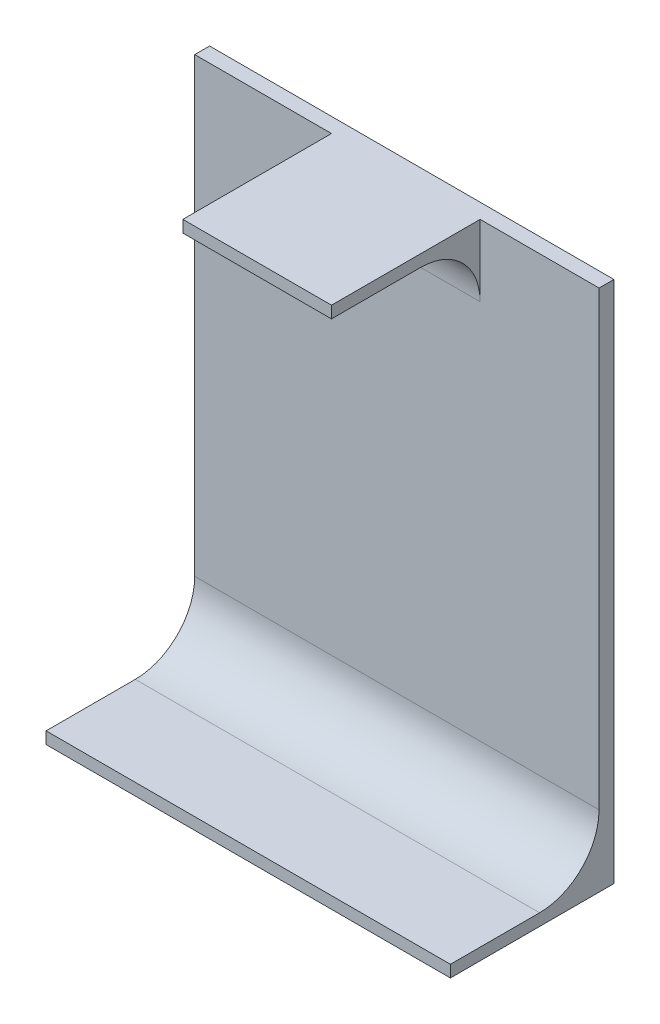
ISO-10303-21;
HEADER;
FILE_DESCRIPTION(('STEP AP214'),'2;1');
FILE_NAME('part.step','',(''),(''),'','','');
FILE_SCHEMA(('AUTOMOTIVE_DESIGN { 1 0 10303 214 1 1 1 1 }'));
ENDSEC;
DATA;
#1=APPLICATION_CONTEXT('core data for automotive mechanical design processes');
#2=APPLICATION_PROTOCOL_DEFINITION('international standard','automotive_design',2000,#1);
#3=PRODUCT_CONTEXT('',#1,'mechanical');
#4=PRODUCT('Part','Part','',(#3));
#5=PRODUCT_RELATED_PRODUCT_CATEGORY('part','',(#4));
#6=PRODUCT_DEFINITION_FORMATION('','',#4);
#7=PRODUCT_DEFINITION_CONTEXT('part definition',#1,'design');
#8=PRODUCT_DEFINITION('design','',#6,#7);
#9=PRODUCT_DEFINITION_SHAPE('','',#8);
#10=(LENGTH_UNIT() NAMED_UNIT(*) SI_UNIT(.MILLI.,.METRE.));
#11=(NAMED_UNIT(*) PLANE_ANGLE_UNIT() SI_UNIT($,.RADIAN.));
#12=(NAMED_UNIT(*) SI_UNIT($,.STERADIAN.) SOLID_ANGLE_UNIT());
#13=UNCERTAINTY_MEASURE_WITH_UNIT(LENGTH_MEASURE(1.E-05),#10,'distance_accuracy_value','');
#14=(GEOMETRIC_REPRESENTATION_CONTEXT(3) GLOBAL_UNCERTAINTY_ASSIGNED_CONTEXT((#13)) GLOBAL_UNIT_ASSIGNED_CONTEXT((#10,
#11,#12)) REPRESENTATION_CONTEXT('',''));
#15=CARTESIAN_POINT('',(0.,0.,0.));
#16=DIRECTION('',(0.,0.,1.));
#17=DIRECTION('',(1.,0.,0.));
#18=AXIS2_PLACEMENT_3D('',#15,#16,#17);
#19=CARTESIAN_POINT('',(-68.,0.,-2.5));
#20=DIRECTION('',(-1.,0.,0.));
#21=DIRECTION('',(0.,-1.,0.));
#22=AXIS2_PLACEMENT_3D('',#19,#20,#21);
#23=PLANE('',#22);
#24=DIRECTION('',(0.,0.,1.));
#25=VECTOR('',#24,1.);
#26=CARTESIAN_POINT('',(-68.,-86.,-2.5));
#27=LINE('',#26,#25);
#28=CARTESIAN_POINT('',(-68.,-86.,10.));
#29=VERTEX_POINT('',#28);
#30=CARTESIAN_POINT('',(-68.,-86.,25.));
#31=VERTEX_POINT('',#30);
#32=EDGE_CURVE('E182',#29,#31,#27,.T.);
#33=ORIENTED_EDGE('',*,*,#32,.F.);
#34=CARTESIAN_POINT('',(-68.,-76.,10.));
#35=DIRECTION('',(-1.,0.,0.));
#36=DIRECTION('',(0.,-1.,0.));
#37=AXIS2_PLACEMENT_3D('',#34,#35,#36);
#38=CIRCLE('',#37,10.);
#39=CARTESIAN_POINT('',(-68.,-76.,0.));
#40=VERTEX_POINT('',#39);
#41=EDGE_CURVE('E176',#29,#40,#38,.F.);
#42=ORIENTED_EDGE('',*,*,#41,.T.);
#43=DIRECTION('',(0.,1.,0.));
#44=VECTOR('',#43,1.);
#45=CARTESIAN_POINT('',(-68.,0.,0.));
#46=LINE('',#45,#44);
#47=CARTESIAN_POINT('',(-68.,0.,0.));
#48=VERTEX_POINT('',#47);
#49=EDGE_CURVE('E165',#40,#48,#46,.T.);
#50=ORIENTED_EDGE('',*,*,#49,.T.);
#51=DIRECTION('',(0.,0.,1.));
#52=VECTOR('',#51,1.);
#53=CARTESIAN_POINT('',(-68.,0.,-2.5));
#54=LINE('',#53,#52);
#55=CARTESIAN_POINT('',(-68.,0.,-2.5));
#56=VERTEX_POINT('',#55);
#57=EDGE_CURVE('E147',#56,#48,#54,.T.);
#58=ORIENTED_EDGE('',*,*,#57,.F.);
#59=DIRECTION('',(0.,-1.,0.));
#60=VECTOR('',#59,1.);
#61=CARTESIAN_POINT('',(-68.,0.,-2.5));
#62=LINE('',#61,#60);
#63=CARTESIAN_POINT('',(-68.,-88.,-2.5));
#64=VERTEX_POINT('',#63);
#65=EDGE_CURVE('E154',#56,#64,#62,.T.);
#66=ORIENTED_EDGE('',*,*,#65,.T.);
#67=DIRECTION('',(0.,0.,1.));
#68=VECTOR('',#67,1.);
#69=CARTESIAN_POINT('',(-68.,-88.,-2.5));
#70=LINE('',#69,#68);
#71=CARTESIAN_POINT('',(-68.,-88.,25.));
#72=VERTEX_POINT('',#71);
#73=EDGE_CURVE('E151',#64,#72,#70,.T.);
#74=ORIENTED_EDGE('',*,*,#73,.T.);
#75=DIRECTION('',(0.,-1.,0.));
#76=VECTOR('',#75,1.);
#77=CARTESIAN_POINT('',(-68.,0.,25.));
#78=LINE('',#77,#76);
#79=EDGE_CURVE('E202',#31,#72,#78,.T.);
#80=ORIENTED_EDGE('',*,*,#79,.F.);
#81=EDGE_LOOP('',(#33,#42,#50,#58,#66,#74,#80));
#82=FACE_BOUND('',#81,.T.);
#83=ADVANCED_FACE('F33',(#82),#23,.T.);
#84=CARTESIAN_POINT('',(0.,0.,-2.5));
#85=DIRECTION('',(0.,1.,0.));
#86=DIRECTION('',(-1.,0.,0.));
#87=AXIS2_PLACEMENT_3D('',#84,#85,#86);
#88=PLANE('',#87);
#89=DIRECTION('',(0.,0.,1.));
#90=VECTOR('',#89,1.);
#91=CARTESIAN_POINT('',(-20.,0.,25.));
#92=LINE('',#91,#90);
#93=CARTESIAN_POINT('',(-20.,0.,0.));
#94=VERTEX_POINT('',#93);
#95=CARTESIAN_POINT('',(-20.,0.,25.));
#96=VERTEX_POINT('',#95);
#97=EDGE_CURVE('E141',#94,#96,#92,.T.);
#98=ORIENTED_EDGE('',*,*,#97,.F.);
#99=DIRECTION('',(-1.,0.,0.));
#100=VECTOR('',#99,1.);
#101=CARTESIAN_POINT('',(0.,0.,0.));
#102=LINE('',#101,#100);
#103=CARTESIAN_POINT('',(0.,0.,0.));
#104=VERTEX_POINT('',#103);
#105=EDGE_CURVE('E126',#104,#94,#102,.T.);
#106=ORIENTED_EDGE('',*,*,#105,.F.);
#107=DIRECTION('',(0.,0.,1.));
#108=VECTOR('',#107,1.);
#109=CARTESIAN_POINT('',(0.,0.,-2.5));
#110=LINE('',#109,#108);
#111=CARTESIAN_POINT('',(0.,0.,-2.5));
#112=VERTEX_POINT('',#111);
#113=EDGE_CURVE('E138',#112,#104,#110,.T.);
#114=ORIENTED_EDGE('',*,*,#113,.F.);
#115=DIRECTION('',(-1.,0.,0.));
#116=VECTOR('',#115,1.);
#117=CARTESIAN_POINT('',(0.,0.,-2.5));
#118=LINE('',#117,#116);
#119=EDGE_CURVE('E208',#112,#56,#118,.T.);
#120=ORIENTED_EDGE('',*,*,#119,.T.);
#121=ORIENTED_EDGE('',*,*,#57,.T.);
#122=DIRECTION('',(1.,0.,0.));
#123=VECTOR('',#122,1.);
#124=CARTESIAN_POINT('',(-68.,0.,0.));
#125=LINE('',#124,#123);
#126=CARTESIAN_POINT('',(-45.,0.,0.));
#127=VERTEX_POINT('',#126);
#128=EDGE_CURVE('E186',#48,#127,#125,.T.);
#129=ORIENTED_EDGE('',*,*,#128,.T.);
#130=DIRECTION('',(0.,0.,-1.));
#131=VECTOR('',#130,1.);
#132=CARTESIAN_POINT('',(-45.,0.,25.));
#133=LINE('',#132,#131);
#134=CARTESIAN_POINT('',(-45.,0.,25.));
#135=VERTEX_POINT('',#134);
#136=EDGE_CURVE('E224',#135,#127,#133,.T.);
#137=ORIENTED_EDGE('',*,*,#136,.F.);
#138=DIRECTION('',(-1.,0.,0.));
#139=VECTOR('',#138,1.);
#140=CARTESIAN_POINT('',(0.,0.,25.));
#141=LINE('',#140,#139);
#142=EDGE_CURVE('E200',#96,#135,#141,.T.);
#143=ORIENTED_EDGE('',*,*,#142,.F.);
#144=EDGE_LOOP('',(#98,#106,#114,#120,#121,#129,#137,#143));
#145=FACE_BOUND('',#144,.T.);
#146=ADVANCED_FACE('F136',(#145),#88,.T.);
#147=CARTESIAN_POINT('',(0.,0.,25.));
#148=DIRECTION('',(0.,0.,-1.));
#149=DIRECTION('',(-1.,0.,0.));
#150=AXIS2_PLACEMENT_3D('',#147,#148,#149);
#151=PLANE('',#150);
#152=DIRECTION('',(1.,0.,0.));
#153=VECTOR('',#152,1.);
#154=CARTESIAN_POINT('',(0.,-2.,25.));
#155=LINE('',#154,#153);
#156=CARTESIAN_POINT('',(-45.,-2.,25.));
#157=VERTEX_POINT('',#156);
#158=CARTESIAN_POINT('',(-20.,-2.,25.));
#159=VERTEX_POINT('',#158);
#160=EDGE_CURVE('E161',#157,#159,#155,.T.);
#161=ORIENTED_EDGE('',*,*,#160,.T.);
#162=DIRECTION('',(0.,1.,0.));
#163=VECTOR('',#162,1.);
#164=CARTESIAN_POINT('',(-20.,-25.,25.));
#165=LINE('',#164,#163);
#166=EDGE_CURVE('E229',#159,#96,#165,.T.);
#167=ORIENTED_EDGE('',*,*,#166,.T.);
#168=ORIENTED_EDGE('',*,*,#142,.T.);
#169=DIRECTION('',(0.,1.,0.));
#170=VECTOR('',#169,1.);
#171=CARTESIAN_POINT('',(-45.,-25.,25.));
#172=LINE('',#171,#170);
#173=EDGE_CURVE('E227',#157,#135,#172,.T.);
#174=ORIENTED_EDGE('',*,*,#173,.F.);
#175=EDGE_LOOP('',(#161,#167,#168,#174));
#176=FACE_BOUND('',#175,.T.);
#177=ADVANCED_FACE('F249',(#176),#151,.F.);
#178=CARTESIAN_POINT('',(0.,0.,-2.5));
#179=DIRECTION('',(1.,0.,0.));
#180=DIRECTION('',(0.,1.,0.));
#181=AXIS2_PLACEMENT_3D('',#178,#179,#180);
#182=PLANE('',#181);
#183=ORIENTED_EDGE('',*,*,#113,.T.);
#184=DIRECTION('',(0.,-1.,0.));
#185=VECTOR('',#184,1.);
#186=CARTESIAN_POINT('',(0.,0.,0.));
#187=LINE('',#186,#185);
#188=CARTESIAN_POINT('',(0.,-76.,0.));
#189=VERTEX_POINT('',#188);
#190=EDGE_CURVE('E122',#104,#189,#187,.T.);
#191=ORIENTED_EDGE('',*,*,#190,.T.);
#192=CARTESIAN_POINT('',(0.,-76.,10.));
#193=DIRECTION('',(1.,0.,0.));
#194=DIRECTION('',(0.,1.,0.));
#195=AXIS2_PLACEMENT_3D('',#192,#193,#194);
#196=CIRCLE('',#195,10.);
#197=CARTESIAN_POINT('',(0.,-86.,10.));
#198=VERTEX_POINT('',#197);
#199=EDGE_CURVE('E174',#189,#198,#196,.F.);
#200=ORIENTED_EDGE('',*,*,#199,.T.);
#201=DIRECTION('',(0.,0.,-1.));
#202=VECTOR('',#201,1.);
#203=CARTESIAN_POINT('',(0.,-86.,-2.5));
#204=LINE('',#203,#202);
#205=CARTESIAN_POINT('',(0.,-86.,25.));
#206=VERTEX_POINT('',#205);
#207=EDGE_CURVE('E133',#206,#198,#204,.T.);
#208=ORIENTED_EDGE('',*,*,#207,.F.);
#209=DIRECTION('',(0.,1.,0.));
#210=VECTOR('',#209,1.);
#211=CARTESIAN_POINT('',(0.,0.,25.));
#212=LINE('',#211,#210);
#213=CARTESIAN_POINT('',(0.,-88.,25.));
#214=VERTEX_POINT('',#213);
#215=EDGE_CURVE('E132',#214,#206,#212,.T.);
#216=ORIENTED_EDGE('',*,*,#215,.F.);
#217=DIRECTION('',(0.,0.,1.));
#218=VECTOR('',#217,1.);
#219=CARTESIAN_POINT('',(0.,-88.,-2.5));
#220=LINE('',#219,#218);
#221=CARTESIAN_POINT('',(0.,-88.,-2.5));
#222=VERTEX_POINT('',#221);
#223=EDGE_CURVE('E162',#222,#214,#220,.T.);
#224=ORIENTED_EDGE('',*,*,#223,.F.);
#225=DIRECTION('',(0.,1.,0.));
#226=VECTOR('',#225,1.);
#227=CARTESIAN_POINT('',(0.,0.,-2.5));
#228=LINE('',#227,#226);
#229=EDGE_CURVE('E146',#222,#112,#228,.T.);
#230=ORIENTED_EDGE('',*,*,#229,.T.);
#231=EDGE_LOOP('',(#183,#191,#200,#208,#216,#224,#230));
#232=FACE_BOUND('',#231,.T.);
#233=ADVANCED_FACE('F144',(#232),#182,.T.);
#234=CARTESIAN_POINT('',(0.,-88.,-2.5));
#235=DIRECTION('',(0.,-1.,0.));
#236=DIRECTION('',(1.,0.,0.));
#237=AXIS2_PLACEMENT_3D('',#234,#235,#236);
#238=PLANE('',#237);
#239=ORIENTED_EDGE('',*,*,#223,.T.);
#240=DIRECTION('',(1.,0.,0.));
#241=VECTOR('',#240,1.);
#242=CARTESIAN_POINT('',(0.,-88.,25.));
#243=LINE('',#242,#241);
#244=EDGE_CURVE('E204',#72,#214,#243,.T.);
#245=ORIENTED_EDGE('',*,*,#244,.F.);
#246=ORIENTED_EDGE('',*,*,#73,.F.);
#247=DIRECTION('',(1.,0.,0.));
#248=VECTOR('',#247,1.);
#249=CARTESIAN_POINT('',(0.,-88.,-2.5));
#250=LINE('',#249,#248);
#251=EDGE_CURVE('E148',#64,#222,#250,.T.);
#252=ORIENTED_EDGE('',*,*,#251,.T.);
#253=EDGE_LOOP('',(#239,#245,#246,#252));
#254=FACE_BOUND('',#253,.T.);
#255=ADVANCED_FACE('F217',(#254),#238,.T.);
#256=CARTESIAN_POINT('',(0.,0.,-2.5));
#257=DIRECTION('',(0.,0.,-1.));
#258=DIRECTION('',(-1.,0.,0.));
#259=AXIS2_PLACEMENT_3D('',#256,#257,#258);
#260=PLANE('',#259);
#261=ORIENTED_EDGE('',*,*,#229,.F.);
#262=ORIENTED_EDGE('',*,*,#251,.F.);
#263=ORIENTED_EDGE('',*,*,#65,.F.);
#264=ORIENTED_EDGE('',*,*,#119,.F.);
#265=EDGE_LOOP('',(#261,#262,#263,#264));
#266=FACE_BOUND('',#265,.T.);
#267=ADVANCED_FACE('F221',(#266),#260,.T.);
#268=ORIENTED_EDGE('',*,*,#215,.T.);
#269=DIRECTION('',(-1.,0.,0.));
#270=VECTOR('',#269,1.);
#271=CARTESIAN_POINT('',(0.,-86.,25.));
#272=LINE('',#271,#270);
#273=EDGE_CURVE('E158',#206,#31,#272,.T.);
#274=ORIENTED_EDGE('',*,*,#273,.T.);
#275=ORIENTED_EDGE('',*,*,#79,.T.);
#276=ORIENTED_EDGE('',*,*,#244,.T.);
#277=EDGE_LOOP('',(#268,#274,#275,#276));
#278=FACE_BOUND('',#277,.T.);
#279=ADVANCED_FACE('F219',(#278),#151,.F.);
#280=CARTESIAN_POINT('',(-75.1787098022731,-2.,0.));
#281=DIRECTION('',(0.,1.,0.));
#282=DIRECTION('',(0.,0.,1.));
#283=AXIS2_PLACEMENT_3D('',#280,#281,#282);
#284=PLANE('',#283);
#285=DIRECTION('',(0.,0.,-1.));
#286=VECTOR('',#285,1.);
#287=CARTESIAN_POINT('',(-45.,-2.,0.));
#288=LINE('',#287,#286);
#289=CARTESIAN_POINT('',(-45.,-2.,10.));
#290=VERTEX_POINT('',#289);
#291=EDGE_CURVE('E195',#157,#290,#288,.T.);
#292=ORIENTED_EDGE('',*,*,#291,.T.);
#293=DIRECTION('',(-1.,0.,0.));
#294=VECTOR('',#293,1.);
#295=CARTESIAN_POINT('',(-75.1787098022731,-2.,10.));
#296=LINE('',#295,#294);
#297=CARTESIAN_POINT('',(-20.,-2.,10.));
#298=VERTEX_POINT('',#297);
#299=EDGE_CURVE('E54',#290,#298,#296,.F.);
#300=ORIENTED_EDGE('',*,*,#299,.T.);
#301=DIRECTION('',(0.,0.,1.));
#302=VECTOR('',#301,1.);
#303=CARTESIAN_POINT('',(-20.,-2.,0.));
#304=LINE('',#303,#302);
#305=EDGE_CURVE('E225',#298,#159,#304,.T.);
#306=ORIENTED_EDGE('',*,*,#305,.T.);
#307=ORIENTED_EDGE('',*,*,#160,.F.);
#308=EDGE_LOOP('',(#292,#300,#306,#307));
#309=FACE_BOUND('',#308,.T.);
#310=ADVANCED_FACE('F237',(#309),#284,.F.);
#311=CARTESIAN_POINT('',(-75.1787098022731,-86.,0.));
#312=DIRECTION('',(0.,-1.,0.));
#313=DIRECTION('',(0.,0.,-1.));
#314=AXIS2_PLACEMENT_3D('',#311,#312,#313);
#315=PLANE('',#314);
#316=ORIENTED_EDGE('',*,*,#207,.T.);
#317=DIRECTION('',(1.,0.,0.));
#318=VECTOR('',#317,1.);
#319=CARTESIAN_POINT('',(-75.1787098022731,-86.,10.));
#320=LINE('',#319,#318);
#321=EDGE_CURVE('E171',#198,#29,#320,.F.);
#322=ORIENTED_EDGE('',*,*,#321,.T.);
#323=ORIENTED_EDGE('',*,*,#32,.T.);
#324=ORIENTED_EDGE('',*,*,#273,.F.);
#325=EDGE_LOOP('',(#316,#322,#323,#324));
#326=FACE_BOUND('',#325,.T.);
#327=ADVANCED_FACE('F193',(#326),#315,.F.);
#328=CARTESIAN_POINT('',(0.,0.,0.));
#329=DIRECTION('',(0.,0.,1.));
#330=DIRECTION('',(1.,0.,0.));
#331=AXIS2_PLACEMENT_3D('',#328,#329,#330);
#332=PLANE('',#331);
#333=ORIENTED_EDGE('',*,*,#49,.F.);
#334=DIRECTION('',(1.,0.,0.));
#335=VECTOR('',#334,1.);
#336=CARTESIAN_POINT('',(0.,-76.,0.));
#337=LINE('',#336,#335);
#338=EDGE_CURVE('E129',#40,#189,#337,.T.);
#339=ORIENTED_EDGE('',*,*,#338,.T.);
#340=ORIENTED_EDGE('',*,*,#190,.F.);
#341=ORIENTED_EDGE('',*,*,#105,.T.);
#342=DIRECTION('',(0.,1.,0.));
#343=VECTOR('',#342,1.);
#344=CARTESIAN_POINT('',(-20.,-25.,0.));
#345=LINE('',#344,#343);
#346=CARTESIAN_POINT('',(-20.,-12.,0.));
#347=VERTEX_POINT('',#346);
#348=EDGE_CURVE('E244',#347,#94,#345,.T.);
#349=ORIENTED_EDGE('',*,*,#348,.F.);
#350=DIRECTION('',(-1.,0.,0.));
#351=VECTOR('',#350,1.);
#352=CARTESIAN_POINT('',(0.,-12.,0.));
#353=LINE('',#352,#351);
#354=CARTESIAN_POINT('',(-45.,-12.,0.));
#355=VERTEX_POINT('',#354);
#356=EDGE_CURVE('E167',#347,#355,#353,.T.);
#357=ORIENTED_EDGE('',*,*,#356,.T.);
#358=DIRECTION('',(0.,1.,0.));
#359=VECTOR('',#358,1.);
#360=CARTESIAN_POINT('',(-45.,-25.,0.));
#361=LINE('',#360,#359);
#362=EDGE_CURVE('E235',#355,#127,#361,.T.);
#363=ORIENTED_EDGE('',*,*,#362,.T.);
#364=ORIENTED_EDGE('',*,*,#128,.F.);
#365=EDGE_LOOP('',(#333,#339,#340,#341,#349,#357,#363,#364));
#366=FACE_BOUND('',#365,.T.);
#367=ADVANCED_FACE('F125',(#366),#332,.T.);
#368=CARTESIAN_POINT('',(-45.,-25.,25.));
#369=DIRECTION('',(1.,0.,0.));
#370=DIRECTION('',(0.,1.,0.));
#371=AXIS2_PLACEMENT_3D('',#368,#369,#370);
#372=PLANE('',#371);
#373=ORIENTED_EDGE('',*,*,#173,.T.);
#374=ORIENTED_EDGE('',*,*,#136,.T.);
#375=ORIENTED_EDGE('',*,*,#362,.F.);
#376=CARTESIAN_POINT('',(-45.,-12.,10.));
#377=DIRECTION('',(1.,0.,0.));
#378=DIRECTION('',(0.,1.,0.));
#379=AXIS2_PLACEMENT_3D('',#376,#377,#378);
#380=CIRCLE('',#379,10.);
#381=EDGE_CURVE('E41',#355,#290,#380,.T.);
#382=ORIENTED_EDGE('',*,*,#381,.T.);
#383=ORIENTED_EDGE('',*,*,#291,.F.);
#384=EDGE_LOOP('',(#373,#374,#375,#382,#383));
#385=FACE_BOUND('',#384,.T.);
#386=ADVANCED_FACE('F250',(#385),#372,.F.);
#387=CARTESIAN_POINT('',(-20.,-25.,25.));
#388=DIRECTION('',(-1.,0.,0.));
#389=DIRECTION('',(0.,-1.,0.));
#390=AXIS2_PLACEMENT_3D('',#387,#388,#389);
#391=PLANE('',#390);
#392=ORIENTED_EDGE('',*,*,#348,.T.);
#393=ORIENTED_EDGE('',*,*,#97,.T.);
#394=ORIENTED_EDGE('',*,*,#166,.F.);
#395=ORIENTED_EDGE('',*,*,#305,.F.);
#396=CARTESIAN_POINT('',(-20.,-12.,10.));
#397=DIRECTION('',(-1.,0.,0.));
#398=DIRECTION('',(0.,-1.,0.));
#399=AXIS2_PLACEMENT_3D('',#396,#397,#398);
#400=CIRCLE('',#399,10.);
#401=EDGE_CURVE('E11',#298,#347,#400,.T.);
#402=ORIENTED_EDGE('',*,*,#401,.T.);
#403=EDGE_LOOP('',(#392,#393,#394,#395,#402));
#404=FACE_BOUND('',#403,.T.);
#405=ADVANCED_FACE('F243',(#404),#391,.F.);
#406=CARTESIAN_POINT('',(0.,-76.,10.));
#407=DIRECTION('',(1.,0.,0.));
#408=DIRECTION('',(0.,0.,-1.));
#409=AXIS2_PLACEMENT_3D('',#406,#407,#408);
#410=CYLINDRICAL_SURFACE('',#409,10.);
#411=ORIENTED_EDGE('',*,*,#41,.F.);
#412=ORIENTED_EDGE('',*,*,#321,.F.);
#413=ORIENTED_EDGE('',*,*,#199,.F.);
#414=ORIENTED_EDGE('',*,*,#338,.F.);
#415=EDGE_LOOP('',(#411,#412,#413,#414));
#416=FACE_BOUND('',#415,.T.);
#417=ADVANCED_FACE('F187',(#416),#410,.F.);
#418=CARTESIAN_POINT('',(0.,-12.,10.));
#419=DIRECTION('',(-1.,0.,0.));
#420=DIRECTION('',(0.,0.,1.));
#421=AXIS2_PLACEMENT_3D('',#418,#419,#420);
#422=CYLINDRICAL_SURFACE('',#421,10.);
#423=ORIENTED_EDGE('',*,*,#401,.F.);
#424=ORIENTED_EDGE('',*,*,#299,.F.);
#425=ORIENTED_EDGE('',*,*,#381,.F.);
#426=ORIENTED_EDGE('',*,*,#356,.F.);
#427=EDGE_LOOP('',(#423,#424,#425,#426));
#428=FACE_BOUND('',#427,.T.);
#429=ADVANCED_FACE('F35',(#428),#422,.F.);
#430=CLOSED_SHELL('',(#83,#146,#177,#233,#255,#267,#279,#310,#327,#367,#386,#405,#417,#429));
#431=MANIFOLD_SOLID_BREP('B2',#430);
#432=ADVANCED_BREP_SHAPE_REPRESENTATION('',(#18,#431),#14);
#433=SHAPE_DEFINITION_REPRESENTATION(#9,#432);
ENDSEC;
END-ISO-10303-21;
